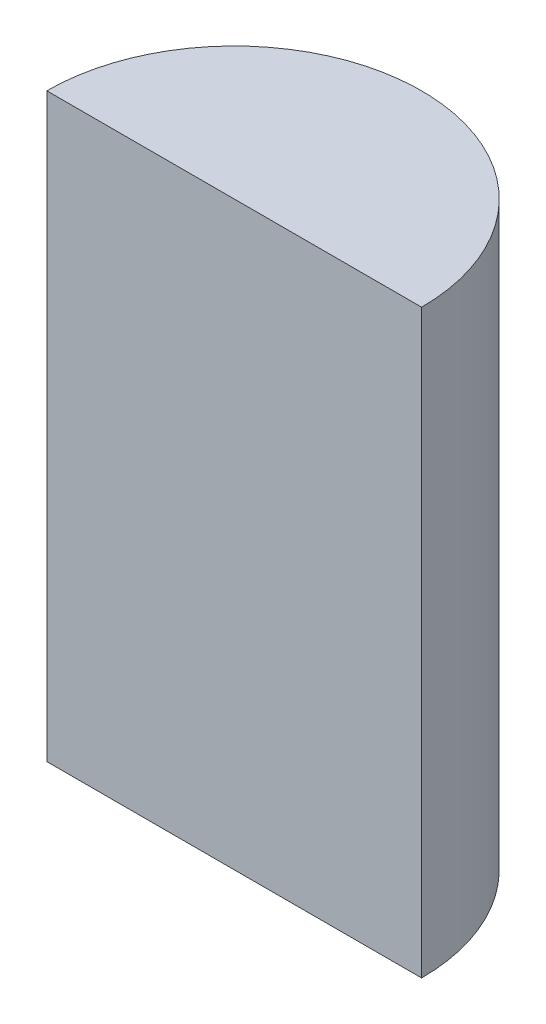
ISO-10303-21;
HEADER;
FILE_DESCRIPTION(('STEP AP214'),'2;1');
FILE_NAME('part.step','',(''),(''),'','','');
FILE_SCHEMA(('AUTOMOTIVE_DESIGN { 1 0 10303 214 1 1 1 1 }'));
ENDSEC;
DATA;
#1=APPLICATION_CONTEXT('core data for automotive mechanical design processes');
#2=APPLICATION_PROTOCOL_DEFINITION('international standard','automotive_design',2000,#1);
#3=PRODUCT_CONTEXT('',#1,'mechanical');
#4=PRODUCT('Part','Part','',(#3));
#5=PRODUCT_RELATED_PRODUCT_CATEGORY('part','',(#4));
#6=PRODUCT_DEFINITION_FORMATION('','',#4);
#7=PRODUCT_DEFINITION_CONTEXT('part definition',#1,'design');
#8=PRODUCT_DEFINITION('design','',#6,#7);
#9=PRODUCT_DEFINITION_SHAPE('','',#8);
#10=(LENGTH_UNIT() NAMED_UNIT(*) SI_UNIT(.MILLI.,.METRE.));
#11=(NAMED_UNIT(*) PLANE_ANGLE_UNIT() SI_UNIT($,.RADIAN.));
#12=(NAMED_UNIT(*) SI_UNIT($,.STERADIAN.) SOLID_ANGLE_UNIT());
#13=UNCERTAINTY_MEASURE_WITH_UNIT(LENGTH_MEASURE(1.E-05),#10,'distance_accuracy_value','');
#14=(GEOMETRIC_REPRESENTATION_CONTEXT(3) GLOBAL_UNCERTAINTY_ASSIGNED_CONTEXT((#13)) GLOBAL_UNIT_ASSIGNED_CONTEXT((#10,
#11,#12)) REPRESENTATION_CONTEXT('',''));
#15=CARTESIAN_POINT('',(0.,0.,0.));
#16=DIRECTION('',(0.,0.,1.));
#17=DIRECTION('',(1.,0.,0.));
#18=AXIS2_PLACEMENT_3D('',#15,#16,#17);
#19=CARTESIAN_POINT('',(0.,31.,0.));
#20=DIRECTION('',(0.,-1.,0.));
#21=DIRECTION('',(0.,0.,-1.));
#22=AXIS2_PLACEMENT_3D('',#19,#20,#21);
#23=CYLINDRICAL_SURFACE('',#22,10.);
#24=CARTESIAN_POINT('',(0.,0.,0.));
#25=DIRECTION('',(0.,1.,0.));
#26=DIRECTION('',(0.,0.,1.));
#27=AXIS2_PLACEMENT_3D('',#24,#25,#26);
#28=CIRCLE('',#27,10.);
#29=CARTESIAN_POINT('',(10.,0.,0.));
#30=VERTEX_POINT('',#29);
#31=CARTESIAN_POINT('',(-10.,0.,0.));
#32=VERTEX_POINT('',#31);
#33=EDGE_CURVE('E64',#30,#32,#28,.T.);
#34=ORIENTED_EDGE('',*,*,#33,.T.);
#35=DIRECTION('',(0.,-1.,0.));
#36=VECTOR('',#35,1.);
#37=CARTESIAN_POINT('',(-10.,31.,0.));
#38=LINE('',#37,#36);
#39=CARTESIAN_POINT('',(-10.,31.,0.));
#40=VERTEX_POINT('',#39);
#41=EDGE_CURVE('E11',#40,#32,#38,.T.);
#42=ORIENTED_EDGE('',*,*,#41,.F.);
#43=CARTESIAN_POINT('',(0.,31.,0.));
#44=DIRECTION('',(0.,1.,0.));
#45=DIRECTION('',(0.,0.,1.));
#46=AXIS2_PLACEMENT_3D('',#43,#44,#45);
#47=CIRCLE('',#46,10.);
#48=CARTESIAN_POINT('',(10.,31.,0.));
#49=VERTEX_POINT('',#48);
#50=EDGE_CURVE('E63',#49,#40,#47,.T.);
#51=ORIENTED_EDGE('',*,*,#50,.F.);
#52=DIRECTION('',(0.,-1.,0.));
#53=VECTOR('',#52,1.);
#54=CARTESIAN_POINT('',(10.,31.,0.));
#55=LINE('',#54,#53);
#56=EDGE_CURVE('E41',#49,#30,#55,.T.);
#57=ORIENTED_EDGE('',*,*,#56,.T.);
#58=EDGE_LOOP('',(#34,#42,#51,#57));
#59=FACE_BOUND('',#58,.T.);
#60=ADVANCED_FACE('F33',(#59),#23,.T.);
#61=CARTESIAN_POINT('',(-10.,31.,0.));
#62=DIRECTION('',(0.,0.,-1.));
#63=DIRECTION('',(-1.,0.,0.));
#64=AXIS2_PLACEMENT_3D('',#61,#62,#63);
#65=PLANE('',#64);
#66=DIRECTION('',(1.,0.,0.));
#67=VECTOR('',#66,1.);
#68=CARTESIAN_POINT('',(-10.,0.,0.));
#69=LINE('',#68,#67);
#70=EDGE_CURVE('E56',#32,#30,#69,.T.);
#71=ORIENTED_EDGE('',*,*,#70,.T.);
#72=ORIENTED_EDGE('',*,*,#56,.F.);
#73=DIRECTION('',(1.,0.,0.));
#74=VECTOR('',#73,1.);
#75=CARTESIAN_POINT('',(-10.,31.,0.));
#76=LINE('',#75,#74);
#77=EDGE_CURVE('E48',#40,#49,#76,.T.);
#78=ORIENTED_EDGE('',*,*,#77,.F.);
#79=ORIENTED_EDGE('',*,*,#41,.T.);
#80=EDGE_LOOP('',(#71,#72,#78,#79));
#81=FACE_BOUND('',#80,.T.);
#82=ADVANCED_FACE('F59',(#81),#65,.F.);
#83=CARTESIAN_POINT('',(0.,31.,0.));
#84=DIRECTION('',(0.,1.,0.));
#85=DIRECTION('',(0.,0.,1.));
#86=AXIS2_PLACEMENT_3D('',#83,#84,#85);
#87=PLANE('',#86);
#88=ORIENTED_EDGE('',*,*,#50,.T.);
#89=ORIENTED_EDGE('',*,*,#77,.T.);
#90=EDGE_LOOP('',(#88,#89));
#91=FACE_BOUND('',#90,.T.);
#92=ADVANCED_FACE('F71',(#91),#87,.T.);
#93=CARTESIAN_POINT('',(0.,0.,0.));
#94=DIRECTION('',(0.,1.,0.));
#95=DIRECTION('',(0.,0.,1.));
#96=AXIS2_PLACEMENT_3D('',#93,#94,#95);
#97=PLANE('',#96);
#98=ORIENTED_EDGE('',*,*,#33,.F.);
#99=ORIENTED_EDGE('',*,*,#70,.F.);
#100=EDGE_LOOP('',(#98,#99));
#101=FACE_BOUND('',#100,.T.);
#102=ADVANCED_FACE('F67',(#101),#97,.F.);
#103=CLOSED_SHELL('',(#60,#82,#92,#102));
#104=MANIFOLD_SOLID_BREP('B2',#103);
#105=ADVANCED_BREP_SHAPE_REPRESENTATION('',(#18,#104),#14);
#106=SHAPE_DEFINITION_REPRESENTATION(#9,#105);
ENDSEC;
END-ISO-10303-21;
